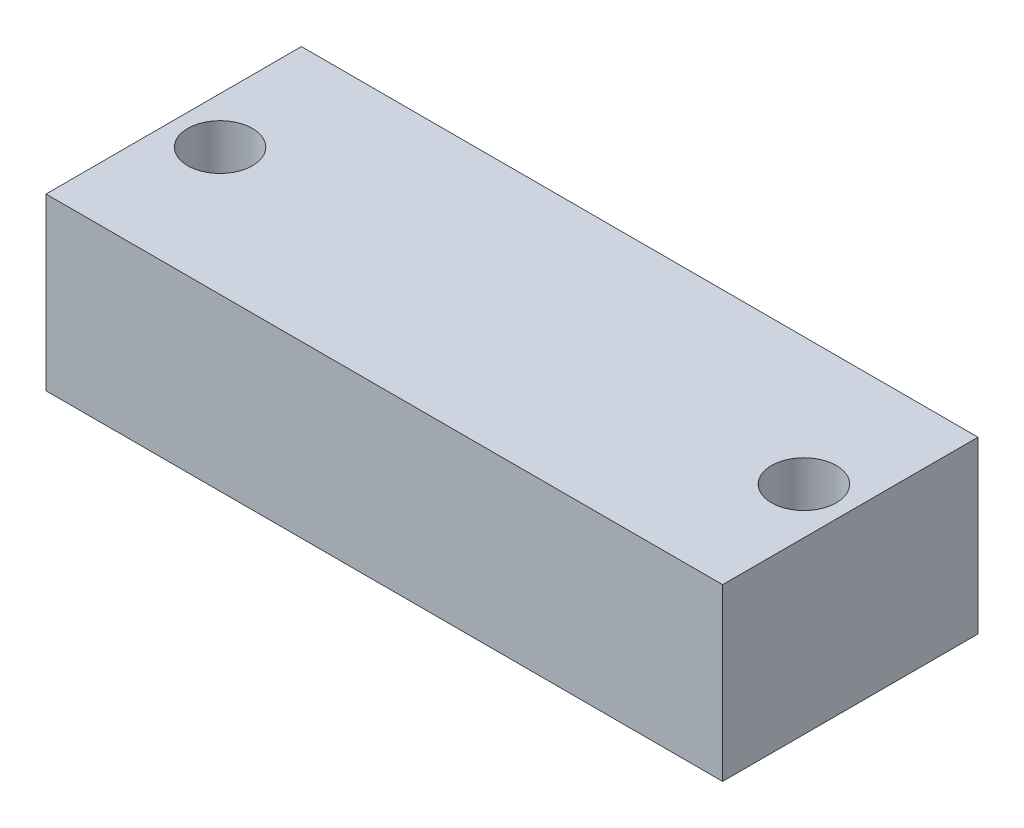
ISO-10303-21;
HEADER;
FILE_DESCRIPTION(('STEP AP214'),'2;1');
FILE_NAME('part.step','',(''),(''),'','','');
FILE_SCHEMA(('AUTOMOTIVE_DESIGN { 1 0 10303 214 1 1 1 1 }'));
ENDSEC;
DATA;
#1=APPLICATION_CONTEXT('core data for automotive mechanical design processes');
#2=APPLICATION_PROTOCOL_DEFINITION('international standard','automotive_design',2000,#1);
#3=PRODUCT_CONTEXT('',#1,'mechanical');
#4=PRODUCT('Part','Part','',(#3));
#5=PRODUCT_RELATED_PRODUCT_CATEGORY('part','',(#4));
#6=PRODUCT_DEFINITION_FORMATION('','',#4);
#7=PRODUCT_DEFINITION_CONTEXT('part definition',#1,'design');
#8=PRODUCT_DEFINITION('design','',#6,#7);
#9=PRODUCT_DEFINITION_SHAPE('','',#8);
#10=(LENGTH_UNIT() NAMED_UNIT(*) SI_UNIT(.MILLI.,.METRE.));
#11=(NAMED_UNIT(*) PLANE_ANGLE_UNIT() SI_UNIT($,.RADIAN.));
#12=(NAMED_UNIT(*) SI_UNIT($,.STERADIAN.) SOLID_ANGLE_UNIT());
#13=UNCERTAINTY_MEASURE_WITH_UNIT(LENGTH_MEASURE(1.E-05),#10,'distance_accuracy_value','');
#14=(GEOMETRIC_REPRESENTATION_CONTEXT(3) GLOBAL_UNCERTAINTY_ASSIGNED_CONTEXT((#13)) GLOBAL_UNIT_ASSIGNED_CONTEXT((#10,
#11,#12)) REPRESENTATION_CONTEXT('',''));
#15=CARTESIAN_POINT('',(0.,0.,0.));
#16=DIRECTION('',(0.,0.,1.));
#17=DIRECTION('',(1.,0.,0.));
#18=AXIS2_PLACEMENT_3D('',#15,#16,#17);
#19=CARTESIAN_POINT('',(0.,20.066,0.));
#20=DIRECTION('',(1.,0.,0.));
#21=DIRECTION('',(0.,0.,-1.));
#22=AXIS2_PLACEMENT_3D('',#19,#20,#21);
#23=PLANE('',#22);
#24=DIRECTION('',(0.,0.,1.));
#25=VECTOR('',#24,1.);
#26=CARTESIAN_POINT('',(0.,0.,0.));
#27=LINE('',#26,#25);
#28=CARTESIAN_POINT('',(0.,0.,-30.0736));
#29=VERTEX_POINT('',#28);
#30=CARTESIAN_POINT('',(0.,0.,0.));
#31=VERTEX_POINT('',#30);
#32=EDGE_CURVE('E96',#29,#31,#27,.T.);
#33=ORIENTED_EDGE('',*,*,#32,.T.);
#34=DIRECTION('',(0.,-1.,0.));
#35=VECTOR('',#34,1.);
#36=CARTESIAN_POINT('',(0.,20.066,0.));
#37=LINE('',#36,#35);
#38=CARTESIAN_POINT('',(0.,20.066,0.));
#39=VERTEX_POINT('',#38);
#40=EDGE_CURVE('E11',#39,#31,#37,.T.);
#41=ORIENTED_EDGE('',*,*,#40,.F.);
#42=DIRECTION('',(0.,0.,1.));
#43=VECTOR('',#42,1.);
#44=CARTESIAN_POINT('',(0.,20.066,0.));
#45=LINE('',#44,#43);
#46=CARTESIAN_POINT('',(0.,20.066,-30.0736));
#47=VERTEX_POINT('',#46);
#48=EDGE_CURVE('E84',#47,#39,#45,.T.);
#49=ORIENTED_EDGE('',*,*,#48,.F.);
#50=DIRECTION('',(0.,-1.,0.));
#51=VECTOR('',#50,1.);
#52=CARTESIAN_POINT('',(0.,20.066,-30.0736));
#53=LINE('',#52,#51);
#54=EDGE_CURVE('E92',#47,#29,#53,.T.);
#55=ORIENTED_EDGE('',*,*,#54,.T.);
#56=EDGE_LOOP('',(#33,#41,#49,#55));
#57=FACE_BOUND('',#56,.T.);
#58=ADVANCED_FACE('F33',(#57),#23,.F.);
#59=CARTESIAN_POINT('',(0.,20.066,0.));
#60=DIRECTION('',(0.,0.,-1.));
#61=DIRECTION('',(-1.,0.,0.));
#62=AXIS2_PLACEMENT_3D('',#59,#60,#61);
#63=PLANE('',#62);
#64=DIRECTION('',(1.,0.,0.));
#65=VECTOR('',#64,1.);
#66=CARTESIAN_POINT('',(0.,0.,0.));
#67=LINE('',#66,#65);
#68=CARTESIAN_POINT('',(79.6671,0.,0.));
#69=VERTEX_POINT('',#68);
#70=EDGE_CURVE('E88',#31,#69,#67,.T.);
#71=ORIENTED_EDGE('',*,*,#70,.T.);
#72=DIRECTION('',(0.,-1.,0.));
#73=VECTOR('',#72,1.);
#74=CARTESIAN_POINT('',(79.6671,20.066,0.));
#75=LINE('',#74,#73);
#76=CARTESIAN_POINT('',(79.6671,20.066,0.));
#77=VERTEX_POINT('',#76);
#78=EDGE_CURVE('E41',#77,#69,#75,.T.);
#79=ORIENTED_EDGE('',*,*,#78,.F.);
#80=DIRECTION('',(1.,0.,0.));
#81=VECTOR('',#80,1.);
#82=CARTESIAN_POINT('',(0.,20.066,0.));
#83=LINE('',#82,#81);
#84=EDGE_CURVE('E79',#39,#77,#83,.T.);
#85=ORIENTED_EDGE('',*,*,#84,.F.);
#86=ORIENTED_EDGE('',*,*,#40,.T.);
#87=EDGE_LOOP('',(#71,#79,#85,#86));
#88=FACE_BOUND('',#87,.T.);
#89=ADVANCED_FACE('F87',(#88),#63,.F.);
#90=CARTESIAN_POINT('',(79.6671,20.066,0.));
#91=DIRECTION('',(-1.,0.,0.));
#92=DIRECTION('',(0.,0.,1.));
#93=AXIS2_PLACEMENT_3D('',#90,#91,#92);
#94=PLANE('',#93);
#95=DIRECTION('',(0.,0.,-1.));
#96=VECTOR('',#95,1.);
#97=CARTESIAN_POINT('',(79.6671,0.,0.));
#98=LINE('',#97,#96);
#99=CARTESIAN_POINT('',(79.6671,0.,-30.0736));
#100=VERTEX_POINT('',#99);
#101=EDGE_CURVE('E66',#69,#100,#98,.T.);
#102=ORIENTED_EDGE('',*,*,#101,.T.);
#103=DIRECTION('',(0.,-1.,0.));
#104=VECTOR('',#103,1.);
#105=CARTESIAN_POINT('',(79.6671,20.066,-30.0736));
#106=LINE('',#105,#104);
#107=CARTESIAN_POINT('',(79.6671,20.066,-30.0736));
#108=VERTEX_POINT('',#107);
#109=EDGE_CURVE('E89',#108,#100,#106,.T.);
#110=ORIENTED_EDGE('',*,*,#109,.F.);
#111=DIRECTION('',(0.,0.,-1.));
#112=VECTOR('',#111,1.);
#113=CARTESIAN_POINT('',(79.6671,20.066,0.));
#114=LINE('',#113,#112);
#115=EDGE_CURVE('E82',#77,#108,#114,.T.);
#116=ORIENTED_EDGE('',*,*,#115,.F.);
#117=ORIENTED_EDGE('',*,*,#78,.T.);
#118=EDGE_LOOP('',(#102,#110,#116,#117));
#119=FACE_BOUND('',#118,.T.);
#120=ADVANCED_FACE('F90',(#119),#94,.F.);
#121=CARTESIAN_POINT('',(0.,20.066,-30.0736));
#122=DIRECTION('',(0.,0.,1.));
#123=DIRECTION('',(1.,0.,0.));
#124=AXIS2_PLACEMENT_3D('',#121,#122,#123);
#125=PLANE('',#124);
#126=DIRECTION('',(-1.,0.,0.));
#127=VECTOR('',#126,1.);
#128=CARTESIAN_POINT('',(0.,0.,-30.0736));
#129=LINE('',#128,#127);
#130=EDGE_CURVE('E72',#100,#29,#129,.T.);
#131=ORIENTED_EDGE('',*,*,#130,.T.);
#132=ORIENTED_EDGE('',*,*,#54,.F.);
#133=DIRECTION('',(-1.,0.,0.));
#134=VECTOR('',#133,1.);
#135=CARTESIAN_POINT('',(0.,20.066,-30.0736));
#136=LINE('',#135,#134);
#137=EDGE_CURVE('E49',#108,#47,#136,.T.);
#138=ORIENTED_EDGE('',*,*,#137,.F.);
#139=ORIENTED_EDGE('',*,*,#109,.T.);
#140=EDGE_LOOP('',(#131,#132,#138,#139));
#141=FACE_BOUND('',#140,.T.);
#142=ADVANCED_FACE('F104',(#141),#125,.F.);
#143=CARTESIAN_POINT('',(0.,20.066,0.));
#144=DIRECTION('',(0.,-1.,0.));
#145=DIRECTION('',(0.,0.,-1.));
#146=AXIS2_PLACEMENT_3D('',#143,#144,#145);
#147=PLANE('',#146);
#148=CARTESIAN_POINT('',(5.46099999999999,20.066,-15.0368));
#149=DIRECTION('',(0.,1.,0.));
#150=DIRECTION('',(0.,0.,1.));
#151=AXIS2_PLACEMENT_3D('',#148,#149,#150);
#152=CIRCLE('',#151,3.81);
#153=CARTESIAN_POINT('',(5.46099999999999,20.066,-11.2268));
#154=VERTEX_POINT('',#153);
#155=EDGE_CURVE('E130',#154,#154,#152,.T.);
#156=ORIENTED_EDGE('',*,*,#155,.F.);
#157=EDGE_LOOP('',(#156));
#158=FACE_BOUND('',#157,.T.);
#159=CARTESIAN_POINT('',(74.2061,20.066,-15.0368));
#160=DIRECTION('',(0.,1.,0.));
#161=DIRECTION('',(0.,0.,1.));
#162=AXIS2_PLACEMENT_3D('',#159,#160,#161);
#163=CIRCLE('',#162,3.80999999999999);
#164=CARTESIAN_POINT('',(74.2061,20.066,-11.2268));
#165=VERTEX_POINT('',#164);
#166=EDGE_CURVE('E118',#165,#165,#163,.T.);
#167=ORIENTED_EDGE('',*,*,#166,.F.);
#168=EDGE_LOOP('',(#167));
#169=FACE_BOUND('',#168,.T.);
#170=ORIENTED_EDGE('',*,*,#48,.T.);
#171=ORIENTED_EDGE('',*,*,#84,.T.);
#172=ORIENTED_EDGE('',*,*,#115,.T.);
#173=ORIENTED_EDGE('',*,*,#137,.T.);
#174=EDGE_LOOP('',(#170,#171,#172,#173));
#175=FACE_BOUND('',#174,.T.);
#176=ADVANCED_FACE('F80',(#158,#169,#175),#147,.F.);
#177=CARTESIAN_POINT('',(0.,0.,0.));
#178=DIRECTION('',(0.,-1.,0.));
#179=DIRECTION('',(0.,0.,-1.));
#180=AXIS2_PLACEMENT_3D('',#177,#178,#179);
#181=PLANE('',#180);
#182=CARTESIAN_POINT('',(5.46099999999999,0.,-15.0368));
#183=DIRECTION('',(0.,1.,0.));
#184=DIRECTION('',(0.,0.,1.));
#185=AXIS2_PLACEMENT_3D('',#182,#183,#184);
#186=CIRCLE('',#185,2.349999999);
#187=CARTESIAN_POINT('',(5.46099999999999,0.,-12.686800001));
#188=VERTEX_POINT('',#187);
#189=EDGE_CURVE('E121',#188,#188,#186,.T.);
#190=ORIENTED_EDGE('',*,*,#189,.T.);
#191=EDGE_LOOP('',(#190));
#192=FACE_BOUND('',#191,.T.);
#193=CARTESIAN_POINT('',(74.2061,0.,-15.0368));
#194=DIRECTION('',(0.,1.,0.));
#195=DIRECTION('',(0.,0.,1.));
#196=AXIS2_PLACEMENT_3D('',#193,#194,#195);
#197=CIRCLE('',#196,2.349999999);
#198=CARTESIAN_POINT('',(74.2061,0.,-12.686800001));
#199=VERTEX_POINT('',#198);
#200=EDGE_CURVE('E99',#199,#199,#197,.T.);
#201=ORIENTED_EDGE('',*,*,#200,.T.);
#202=EDGE_LOOP('',(#201));
#203=FACE_BOUND('',#202,.T.);
#204=ORIENTED_EDGE('',*,*,#32,.F.);
#205=ORIENTED_EDGE('',*,*,#130,.F.);
#206=ORIENTED_EDGE('',*,*,#101,.F.);
#207=ORIENTED_EDGE('',*,*,#70,.F.);
#208=EDGE_LOOP('',(#204,#205,#206,#207));
#209=FACE_BOUND('',#208,.T.);
#210=ADVANCED_FACE('F107',(#192,#203,#209),#181,.T.);
#211=CARTESIAN_POINT('',(74.2061,20.066,-15.0368));
#212=DIRECTION('',(0.,1.,0.));
#213=DIRECTION('',(0.,0.,1.));
#214=AXIS2_PLACEMENT_3D('',#211,#212,#213);
#215=CYLINDRICAL_SURFACE('',#214,2.349999999);
#216=ORIENTED_EDGE('',*,*,#200,.F.);
#217=EDGE_LOOP('',(#216));
#218=FACE_BOUND('',#217,.T.);
#219=CARTESIAN_POINT('',(74.2061,5.842,-15.0368));
#220=DIRECTION('',(0.,1.,0.));
#221=DIRECTION('',(0.,0.,1.));
#222=AXIS2_PLACEMENT_3D('',#219,#220,#221);
#223=CIRCLE('',#222,2.349999999);
#224=CARTESIAN_POINT('',(74.2061,5.842,-12.686800001));
#225=VERTEX_POINT('',#224);
#226=EDGE_CURVE('E112',#225,#225,#223,.T.);
#227=ORIENTED_EDGE('',*,*,#226,.T.);
#228=EDGE_LOOP('',(#227));
#229=FACE_BOUND('',#228,.T.);
#230=ADVANCED_FACE('F154',(#218,#229),#215,.F.);
#231=CARTESIAN_POINT('',(76.556099999,5.842,-15.0368));
#232=DIRECTION('',(0.,-1.,0.));
#233=DIRECTION('',(0.,0.,-1.));
#234=AXIS2_PLACEMENT_3D('',#231,#232,#233);
#235=PLANE('',#234);
#236=ORIENTED_EDGE('',*,*,#226,.F.);
#237=EDGE_LOOP('',(#236));
#238=FACE_BOUND('',#237,.T.);
#239=CARTESIAN_POINT('',(74.2061,5.842,-15.0368));
#240=DIRECTION('',(0.,1.,0.));
#241=DIRECTION('',(0.,0.,1.));
#242=AXIS2_PLACEMENT_3D('',#239,#240,#241);
#243=CIRCLE('',#242,3.80999999999999);
#244=CARTESIAN_POINT('',(74.2061,5.842,-11.2268));
#245=VERTEX_POINT('',#244);
#246=EDGE_CURVE('E115',#245,#245,#243,.T.);
#247=ORIENTED_EDGE('',*,*,#246,.T.);
#248=EDGE_LOOP('',(#247));
#249=FACE_BOUND('',#248,.T.);
#250=ADVANCED_FACE('F144',(#238,#249),#235,.F.);
#251=CARTESIAN_POINT('',(74.2061,20.066,-15.0368));
#252=DIRECTION('',(0.,1.,0.));
#253=DIRECTION('',(0.,0.,1.));
#254=AXIS2_PLACEMENT_3D('',#251,#252,#253);
#255=CYLINDRICAL_SURFACE('',#254,3.80999999999999);
#256=ORIENTED_EDGE('',*,*,#246,.F.);
#257=EDGE_LOOP('',(#256));
#258=FACE_BOUND('',#257,.T.);
#259=ORIENTED_EDGE('',*,*,#166,.T.);
#260=EDGE_LOOP('',(#259));
#261=FACE_BOUND('',#260,.T.);
#262=ADVANCED_FACE('F141',(#258,#261),#255,.F.);
#263=CARTESIAN_POINT('',(5.46099999999999,20.066,-15.0368));
#264=DIRECTION('',(0.,1.,0.));
#265=DIRECTION('',(0.,0.,1.));
#266=AXIS2_PLACEMENT_3D('',#263,#264,#265);
#267=CYLINDRICAL_SURFACE('',#266,2.349999999);
#268=ORIENTED_EDGE('',*,*,#189,.F.);
#269=EDGE_LOOP('',(#268));
#270=FACE_BOUND('',#269,.T.);
#271=CARTESIAN_POINT('',(5.46099999999999,5.842,-15.0368));
#272=DIRECTION('',(0.,1.,0.));
#273=DIRECTION('',(0.,0.,1.));
#274=AXIS2_PLACEMENT_3D('',#271,#272,#273);
#275=CIRCLE('',#274,2.349999999);
#276=CARTESIAN_POINT('',(5.46099999999999,5.842,-12.686800001));
#277=VERTEX_POINT('',#276);
#278=EDGE_CURVE('E124',#277,#277,#275,.T.);
#279=ORIENTED_EDGE('',*,*,#278,.T.);
#280=EDGE_LOOP('',(#279));
#281=FACE_BOUND('',#280,.T.);
#282=ADVANCED_FACE('F143',(#270,#281),#267,.F.);
#283=CARTESIAN_POINT('',(7.81099999899999,5.842,-15.0368));
#284=DIRECTION('',(0.,-1.,0.));
#285=DIRECTION('',(0.,0.,-1.));
#286=AXIS2_PLACEMENT_3D('',#283,#284,#285);
#287=PLANE('',#286);
#288=ORIENTED_EDGE('',*,*,#278,.F.);
#289=EDGE_LOOP('',(#288));
#290=FACE_BOUND('',#289,.T.);
#291=CARTESIAN_POINT('',(5.46099999999999,5.842,-15.0368));
#292=DIRECTION('',(0.,1.,0.));
#293=DIRECTION('',(0.,0.,1.));
#294=AXIS2_PLACEMENT_3D('',#291,#292,#293);
#295=CIRCLE('',#294,3.81);
#296=CARTESIAN_POINT('',(5.46099999999999,5.842,-11.2268));
#297=VERTEX_POINT('',#296);
#298=EDGE_CURVE('E127',#297,#297,#295,.T.);
#299=ORIENTED_EDGE('',*,*,#298,.T.);
#300=EDGE_LOOP('',(#299));
#301=FACE_BOUND('',#300,.T.);
#302=ADVANCED_FACE('F151',(#290,#301),#287,.F.);
#303=CARTESIAN_POINT('',(5.46099999999999,20.066,-15.0368));
#304=DIRECTION('',(0.,1.,0.));
#305=DIRECTION('',(0.,0.,1.));
#306=AXIS2_PLACEMENT_3D('',#303,#304,#305);
#307=CYLINDRICAL_SURFACE('',#306,3.81);
#308=ORIENTED_EDGE('',*,*,#298,.F.);
#309=EDGE_LOOP('',(#308));
#310=FACE_BOUND('',#309,.T.);
#311=ORIENTED_EDGE('',*,*,#155,.T.);
#312=EDGE_LOOP('',(#311));
#313=FACE_BOUND('',#312,.T.);
#314=ADVANCED_FACE('F134',(#310,#313),#307,.F.);
#315=CLOSED_SHELL('',(#58,#89,#120,#142,#176,#210,#230,#250,#262,#282,#302,#314));
#316=MANIFOLD_SOLID_BREP('B2',#315);
#317=ADVANCED_BREP_SHAPE_REPRESENTATION('',(#18,#316),#14);
#318=SHAPE_DEFINITION_REPRESENTATION(#9,#317);
ENDSEC;
END-ISO-10303-21;
